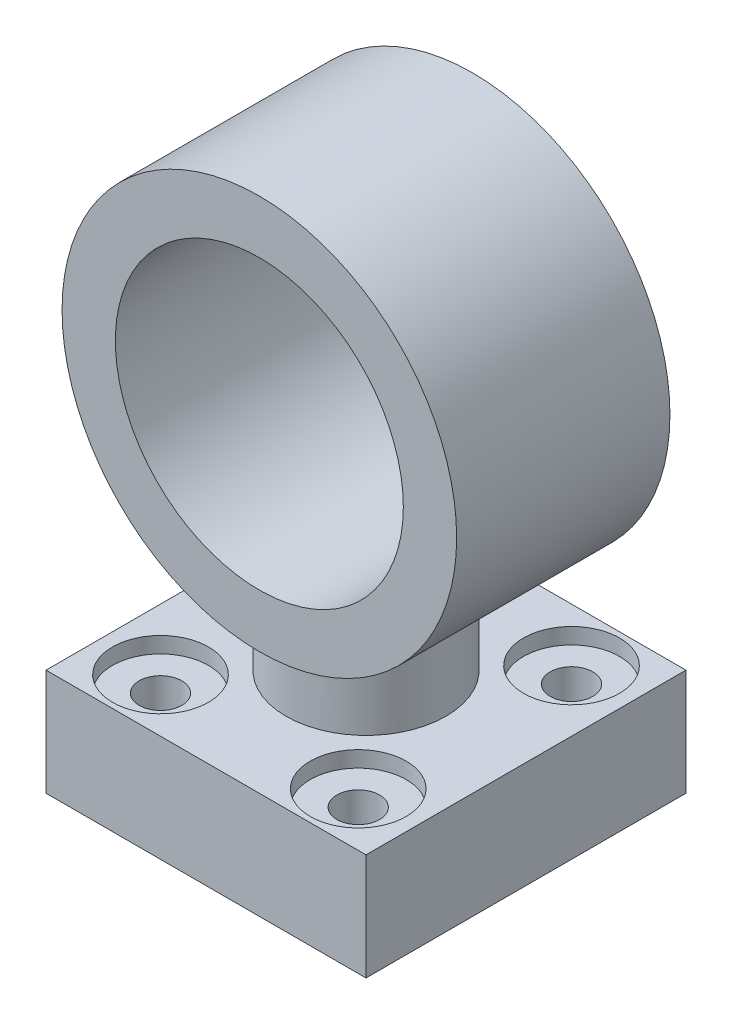
ISO-10303-21;
HEADER;
FILE_DESCRIPTION(('STEP AP214'),'2;1');
FILE_NAME('part.step','',(''),(''),'','','');
FILE_SCHEMA(('AUTOMOTIVE_DESIGN { 1 0 10303 214 1 1 1 1 }'));
ENDSEC;
DATA;
#1=APPLICATION_CONTEXT('core data for automotive mechanical design processes');
#2=APPLICATION_PROTOCOL_DEFINITION('international standard','automotive_design',2000,#1);
#3=PRODUCT_CONTEXT('',#1,'mechanical');
#4=PRODUCT('Part','Part','',(#3));
#5=PRODUCT_RELATED_PRODUCT_CATEGORY('part','',(#4));
#6=PRODUCT_DEFINITION_FORMATION('','',#4);
#7=PRODUCT_DEFINITION_CONTEXT('part definition',#1,'design');
#8=PRODUCT_DEFINITION('design','',#6,#7);
#9=PRODUCT_DEFINITION_SHAPE('','',#8);
#10=(LENGTH_UNIT() NAMED_UNIT(*) SI_UNIT(.MILLI.,.METRE.));
#11=(NAMED_UNIT(*) PLANE_ANGLE_UNIT() SI_UNIT($,.RADIAN.));
#12=(NAMED_UNIT(*) SI_UNIT($,.STERADIAN.) SOLID_ANGLE_UNIT());
#13=UNCERTAINTY_MEASURE_WITH_UNIT(LENGTH_MEASURE(1.E-05),#10,'distance_accuracy_value','');
#14=(GEOMETRIC_REPRESENTATION_CONTEXT(3) GLOBAL_UNCERTAINTY_ASSIGNED_CONTEXT((#13)) GLOBAL_UNIT_ASSIGNED_CONTEXT((#10,
#11,#12)) REPRESENTATION_CONTEXT('',''));
#15=CARTESIAN_POINT('',(0.,0.,0.));
#16=DIRECTION('',(0.,0.,1.));
#17=DIRECTION('',(1.,0.,0.));
#18=AXIS2_PLACEMENT_3D('',#15,#16,#17);
#19=CARTESIAN_POINT('',(-9.27044025157248,-20.,10.));
#20=DIRECTION('',(0.,-1.,0.));
#21=DIRECTION('',(0.,0.,-1.));
#22=AXIS2_PLACEMENT_3D('',#19,#20,#21);
#23=CYLINDRICAL_SURFACE('',#22,2.);
#24=CARTESIAN_POINT('',(-9.27044025157248,-35.,10.));
#25=DIRECTION('',(0.,-1.,0.));
#26=DIRECTION('',(0.,0.,-1.));
#27=AXIS2_PLACEMENT_3D('',#24,#25,#26);
#28=CIRCLE('',#27,2.);
#29=CARTESIAN_POINT('',(-9.27044025157248,-35.,8.));
#30=VERTEX_POINT('',#29);
#31=EDGE_CURVE('E111',#30,#30,#28,.T.);
#32=ORIENTED_EDGE('',*,*,#31,.T.);
#33=EDGE_LOOP('',(#32));
#34=FACE_BOUND('',#33,.T.);
#35=CARTESIAN_POINT('',(-9.27044025157248,-26.5,10.));
#36=DIRECTION('',(0.,1.,0.));
#37=DIRECTION('',(0.,0.,1.));
#38=AXIS2_PLACEMENT_3D('',#35,#36,#37);
#39=CIRCLE('',#38,2.);
#40=CARTESIAN_POINT('',(-9.27044025157248,-26.5,12.));
#41=VERTEX_POINT('',#40);
#42=EDGE_CURVE('E42',#41,#41,#39,.F.);
#43=ORIENTED_EDGE('',*,*,#42,.F.);
#44=EDGE_LOOP('',(#43));
#45=FACE_BOUND('',#44,.T.);
#46=ADVANCED_FACE('F37',(#34,#45),#23,.F.);
#47=CARTESIAN_POINT('',(9.27044025157248,-20.,-10.));
#48=DIRECTION('',(0.,-1.,0.));
#49=DIRECTION('',(0.,0.,-1.));
#50=AXIS2_PLACEMENT_3D('',#47,#48,#49);
#51=CYLINDRICAL_SURFACE('',#50,2.);
#52=CARTESIAN_POINT('',(9.27044025157248,-35.,-10.));
#53=DIRECTION('',(0.,-1.,0.));
#54=DIRECTION('',(0.,0.,-1.));
#55=AXIS2_PLACEMENT_3D('',#52,#53,#54);
#56=CIRCLE('',#55,2.);
#57=CARTESIAN_POINT('',(9.27044025157248,-35.,-12.));
#58=VERTEX_POINT('',#57);
#59=EDGE_CURVE('E202',#58,#58,#56,.T.);
#60=ORIENTED_EDGE('',*,*,#59,.T.);
#61=EDGE_LOOP('',(#60));
#62=FACE_BOUND('',#61,.T.);
#63=CARTESIAN_POINT('',(9.27044025157248,-26.5,-10.));
#64=DIRECTION('',(0.,1.,0.));
#65=DIRECTION('',(0.,0.,1.));
#66=AXIS2_PLACEMENT_3D('',#63,#64,#65);
#67=CIRCLE('',#66,2.);
#68=CARTESIAN_POINT('',(9.27044025157248,-26.5,-8.));
#69=VERTEX_POINT('',#68);
#70=EDGE_CURVE('E421',#69,#69,#67,.F.);
#71=ORIENTED_EDGE('',*,*,#70,.F.);
#72=EDGE_LOOP('',(#71));
#73=FACE_BOUND('',#72,.T.);
#74=ADVANCED_FACE('F161',(#62,#73),#51,.F.);
#75=CARTESIAN_POINT('',(-9.27044025157248,-20.,-10.));
#76=DIRECTION('',(0.,-1.,0.));
#77=DIRECTION('',(0.,0.,-1.));
#78=AXIS2_PLACEMENT_3D('',#75,#76,#77);
#79=CYLINDRICAL_SURFACE('',#78,2.);
#80=CARTESIAN_POINT('',(-9.27044025157248,-35.,-10.));
#81=DIRECTION('',(0.,-1.,0.));
#82=DIRECTION('',(0.,0.,-1.));
#83=AXIS2_PLACEMENT_3D('',#80,#81,#82);
#84=CIRCLE('',#83,2.);
#85=CARTESIAN_POINT('',(-9.27044025157248,-35.,-12.));
#86=VERTEX_POINT('',#85);
#87=EDGE_CURVE('E199',#86,#86,#84,.T.);
#88=ORIENTED_EDGE('',*,*,#87,.T.);
#89=EDGE_LOOP('',(#88));
#90=FACE_BOUND('',#89,.T.);
#91=CARTESIAN_POINT('',(-9.27044025157248,-26.5,-10.));
#92=DIRECTION('',(0.,1.,0.));
#93=DIRECTION('',(0.,0.,1.));
#94=AXIS2_PLACEMENT_3D('',#91,#92,#93);
#95=CIRCLE('',#94,2.);
#96=CARTESIAN_POINT('',(-9.27044025157248,-26.5,-8.));
#97=VERTEX_POINT('',#96);
#98=EDGE_CURVE('E423',#97,#97,#95,.F.);
#99=ORIENTED_EDGE('',*,*,#98,.F.);
#100=EDGE_LOOP('',(#99));
#101=FACE_BOUND('',#100,.T.);
#102=ADVANCED_FACE('F167',(#90,#101),#79,.F.);
#103=CARTESIAN_POINT('',(9.27044025157248,-20.,10.));
#104=DIRECTION('',(0.,-1.,0.));
#105=DIRECTION('',(0.,0.,-1.));
#106=AXIS2_PLACEMENT_3D('',#103,#104,#105);
#107=CYLINDRICAL_SURFACE('',#106,2.);
#108=CARTESIAN_POINT('',(9.27044025157248,-35.,10.));
#109=DIRECTION('',(0.,-1.,0.));
#110=DIRECTION('',(0.,0.,-1.));
#111=AXIS2_PLACEMENT_3D('',#108,#109,#110);
#112=CIRCLE('',#111,2.);
#113=CARTESIAN_POINT('',(9.27044025157248,-35.,8.));
#114=VERTEX_POINT('',#113);
#115=EDGE_CURVE('E198',#114,#114,#112,.T.);
#116=ORIENTED_EDGE('',*,*,#115,.T.);
#117=EDGE_LOOP('',(#116));
#118=FACE_BOUND('',#117,.T.);
#119=CARTESIAN_POINT('',(9.27044025157248,-26.5,10.));
#120=DIRECTION('',(0.,1.,0.));
#121=DIRECTION('',(0.,0.,1.));
#122=AXIS2_PLACEMENT_3D('',#119,#120,#121);
#123=CIRCLE('',#122,2.);
#124=CARTESIAN_POINT('',(9.27044025157248,-26.5,12.));
#125=VERTEX_POINT('',#124);
#126=EDGE_CURVE('E136',#125,#125,#123,.F.);
#127=ORIENTED_EDGE('',*,*,#126,.F.);
#128=EDGE_LOOP('',(#127));
#129=FACE_BOUND('',#128,.T.);
#130=ADVANCED_FACE('F249',(#118,#129),#107,.F.);
#131=CARTESIAN_POINT('',(0.,0.,10.));
#132=DIRECTION('',(0.,0.,-1.));
#133=DIRECTION('',(-1.,0.,0.));
#134=AXIS2_PLACEMENT_3D('',#131,#132,#133);
#135=CYLINDRICAL_SURFACE('',#134,18.5);
#136=CARTESIAN_POINT('',(0.,0.,10.));
#137=DIRECTION('',(0.,0.,1.));
#138=DIRECTION('',(1.,0.,0.));
#139=AXIS2_PLACEMENT_3D('',#136,#137,#138);
#140=CIRCLE('',#139,18.5);
#141=CARTESIAN_POINT('',(18.5,0.,10.));
#142=VERTEX_POINT('',#141);
#143=EDGE_CURVE('E48',#142,#142,#140,.T.);
#144=ORIENTED_EDGE('',*,*,#143,.F.);
#145=EDGE_LOOP('',(#144));
#146=FACE_BOUND('',#145,.T.);
#147=CARTESIAN_POINT('',(0.,0.,-10.));
#148=DIRECTION('',(0.,0.,1.));
#149=DIRECTION('',(1.,0.,0.));
#150=AXIS2_PLACEMENT_3D('',#147,#148,#149);
#151=CIRCLE('',#150,18.5);
#152=CARTESIAN_POINT('',(18.5,0.,-10.));
#153=VERTEX_POINT('',#152);
#154=EDGE_CURVE('E125',#153,#153,#151,.T.);
#155=ORIENTED_EDGE('',*,*,#154,.T.);
#156=EDGE_LOOP('',(#155));
#157=FACE_BOUND('',#156,.T.);
#158=CARTESIAN_POINT('',(0.,-18.5,-7.5));
#159=CARTESIAN_POINT('',(0.201422121752184,-18.4999990328544,-7.49999877105642));
#160=CARTESIAN_POINT('',(0.402918862864895,-18.4967013616093,-7.49187469466253));
#161=CARTESIAN_POINT('',(0.804483964389173,-18.4835930999458,-7.45945228511354));
#162=CARTESIAN_POINT('',(1.00455129959909,-18.4737782328099,-7.43514333108197));
#163=CARTESIAN_POINT('',(1.40211676524176,-18.4478678444109,-7.37052953386558));
#164=CARTESIAN_POINT('',(1.59960854623983,-18.4317590458145,-7.33019087219798));
#165=CARTESIAN_POINT('',(1.99024923810295,-18.3936794594012,-7.23390611661211));
#166=CARTESIAN_POINT('',(2.18339633804079,-18.3717062745744,-7.17795364027382));
#167=CARTESIAN_POINT('',(2.56325558935261,-18.3225616152204,-7.05121696220772));
#168=CARTESIAN_POINT('',(2.74998916086765,-18.2954099488868,-6.98048918223338));
#169=CARTESIAN_POINT('',(3.11668633030813,-18.236522913892,-6.82465908531963));
#170=CARTESIAN_POINT('',(3.29664733333966,-18.2047858104214,-6.73955132592533));
#171=CARTESIAN_POINT('',(3.64855035166081,-18.1375342743215,-6.55571960537027));
#172=CARTESIAN_POINT('',(3.82049836736329,-18.1020227356975,-6.45700605929998));
#173=CARTESIAN_POINT('',(4.15565333403188,-18.0280340597832,-6.24657627183053));
#174=CARTESIAN_POINT('',(4.318857087604,-17.9895558500864,-6.134855320937));
#175=CARTESIAN_POINT('',(4.64255094197372,-17.9088176099161,-5.89399502013234));
#176=CARTESIAN_POINT('',(4.80261058969948,-17.8664657904514,-5.76430774938712));
#177=CARTESIAN_POINT('',(5.11135960892274,-17.7805985333178,-5.49238780930597));
#178=CARTESIAN_POINT('',(5.26004858039983,-17.7370830547839,-5.35015469898608));
#179=CARTESIAN_POINT('',(5.54533199568612,-17.6499732034,-5.05387099423345));
#180=CARTESIAN_POINT('',(5.68191853453983,-17.6063787976891,-4.8998127968092));
#181=CARTESIAN_POINT('',(5.94205832964912,-17.520294285042,-4.58086027342387));
#182=CARTESIAN_POINT('',(6.06561590861363,-17.4778038153937,-4.41596957109371));
#183=CARTESIAN_POINT('',(6.30441245472695,-17.3931358314704,-4.06827994071179));
#184=CARTESIAN_POINT('',(6.41899715321113,-17.3510648072536,-3.8850047773419));
#185=CARTESIAN_POINT('',(6.63218317737933,-17.2707013519035,-3.50868793927397));
#186=CARTESIAN_POINT('',(6.73079101370815,-17.2324073841039,-3.31565028512759));
#187=CARTESIAN_POINT('',(6.91120661388917,-17.1608463268112,-2.92100753245125));
#188=CARTESIAN_POINT('',(6.9930170739032,-17.1275784308057,-2.71940381514749));
#189=CARTESIAN_POINT('',(7.13903680282151,-17.0672318951359,-2.30902071214637));
#190=CARTESIAN_POINT('',(7.20324730363535,-17.0401528223069,-2.10024182982664));
#191=CARTESIAN_POINT('',(7.31080282984704,-16.9942761606526,-1.68690099382171));
#192=CARTESIAN_POINT('',(7.35497541266203,-16.9751535236755,-1.48259047637071));
#193=CARTESIAN_POINT('',(7.42615973107061,-16.9441336720491,-1.07045552069225));
#194=CARTESIAN_POINT('',(7.45317197223554,-16.932236244534,-0.862631186172712));
#195=CARTESIAN_POINT('',(7.48970127630269,-16.9161099348048,-0.44524460530172));
#196=CARTESIAN_POINT('',(7.4992260127419,-16.9118776891112,-0.235683161765361));
#197=CARTESIAN_POINT('',(7.50068324500763,-16.9112316042474,0.183507882082435));
#198=CARTESIAN_POINT('',(7.49261659430145,-16.9148173857762,0.393137478593989));
#199=CARTESIAN_POINT('',(7.46021087725753,-16.9291326530356,0.795633896421227));
#200=CARTESIAN_POINT('',(7.43708752496219,-16.9393282004559,0.988619156674094));
#201=CARTESIAN_POINT('',(7.37602002680758,-16.966008321552,1.37185635962649));
#202=CARTESIAN_POINT('',(7.33807076676344,-16.9824950653251,1.56210733563273));
#203=CARTESIAN_POINT('',(7.24773757689199,-17.0212428904478,1.93849189344553));
#204=CARTESIAN_POINT('',(7.19535718537566,-17.0435025562795,2.12462647246549));
#205=CARTESIAN_POINT('',(7.07661128195854,-17.0931480713131,2.49174830381872));
#206=CARTESIAN_POINT('',(7.01024038896313,-17.1205358924769,2.67273354510096));
#207=CARTESIAN_POINT('',(6.8625845367445,-17.1802619259301,3.03206652762431));
#208=CARTESIAN_POINT('',(6.78102419206458,-17.2126893388475,3.21028616118283));
#209=CARTESIAN_POINT('',(6.60451404688437,-17.2811849876929,3.55930511601025));
#210=CARTESIAN_POINT('',(6.50955971629863,-17.3172544542507,3.73010190106728));
#211=CARTESIAN_POINT('',(6.30690707675619,-17.3920840433727,4.06336837496765));
#212=CARTESIAN_POINT('',(6.19920700512003,-17.430844537787,4.22583690758755));
#213=CARTESIAN_POINT('',(5.97171744568,-17.5100855874212,4.54163695968856));
#214=CARTESIAN_POINT('',(5.85192731658344,-17.550566233817,4.6949679938027));
#215=CARTESIAN_POINT('',(5.5908819484677,-17.6355421933932,5.00360697368469));
#216=CARTESIAN_POINT('',(5.44867652396041,-17.6800999921127,5.1580953166478));
#217=CARTESIAN_POINT('',(5.15181452271063,-17.7688716371796,5.45461355394256));
#218=CARTESIAN_POINT('',(4.9971616060238,-17.8130855804712,5.59664708500135));
#219=CARTESIAN_POINT('',(4.6761463093742,-17.9000368535101,5.86751943447496));
#220=CARTESIAN_POINT('',(4.50977711788315,-17.9427733023958,5.9963504686649));
#221=CARTESIAN_POINT('',(4.16642596233296,-18.0255947467599,6.23980497815171));
#222=CARTESIAN_POINT('',(3.98944827989036,-18.0656807983902,6.35443412883797));
#223=CARTESIAN_POINT('',(3.62198049634587,-18.1429668883961,6.57097387363341));
#224=CARTESIAN_POINT('',(3.43128274002971,-18.1800871651368,6.67256116207671));
#225=CARTESIAN_POINT('',(3.04117392752266,-18.2493968375346,6.85915361093518));
#226=CARTESIAN_POINT('',(2.84176665699116,-18.2815883486381,6.9441658897204));
#227=CARTESIAN_POINT('',(2.43561381907153,-18.3401163548394,7.09681895194935));
#228=CARTESIAN_POINT('',(2.22886969639431,-18.3664539952946,7.16446313400473));
#229=CARTESIAN_POINT('',(1.80959861933909,-18.4124907104072,7.28167038552696));
#230=CARTESIAN_POINT('',(1.59707207888027,-18.4321902588909,7.33123474555033));
#231=CARTESIAN_POINT('',(1.18097318854788,-18.463373605401,7.40927536777576));
#232=CARTESIAN_POINT('',(0.977637510231015,-18.475282524884,7.43884649173111));
#233=CARTESIAN_POINT('',(0.568946328512102,-18.4923800794846,7.48120975582348));
#234=CARTESIAN_POINT('',(0.363590906867655,-18.4975689855041,7.49400257233965));
#235=CARTESIAN_POINT('',(-0.0474864145881197,-18.5010806919054,7.50266632283379));
#236=CARTESIAN_POINT('',(-0.253208217993976,-18.4994050898404,7.49854119406631));
#237=CARTESIAN_POINT('',(-0.663446820263312,-18.4892383502882,7.47342405906379));
#238=CARTESIAN_POINT('',(-0.86796364329637,-18.4807473499769,7.45243239230711));
#239=CARTESIAN_POINT('',(-1.26471586772626,-18.4577389104402,7.39518591232671));
#240=CARTESIAN_POINT('',(-1.4570788216687,-18.4435213849994,7.35968957043622));
#241=CARTESIAN_POINT('',(-1.8380388693583,-18.409459490462,7.27390873642982));
#242=CARTESIAN_POINT('',(-2.02663462253012,-18.3896131552097,7.22361907674673));
#243=CARTESIAN_POINT('',(-2.3987214942848,-18.3447879322591,7.10872976228476));
#244=CARTESIAN_POINT('',(-2.58221407748269,-18.3198105348059,7.04413426201242));
#245=CARTESIAN_POINT('',(-2.94311568181697,-18.2653057156592,6.90114203710166));
#246=CARTESIAN_POINT('',(-3.12052235696178,-18.2357765629266,6.82274006021812));
#247=CARTESIAN_POINT('',(-3.47347176211831,-18.1719049128132,6.65016891133092));
#248=CARTESIAN_POINT('',(-3.64879399739684,-18.1374434083742,6.55559297811237));
#249=CARTESIAN_POINT('',(-3.99092926647629,-18.0652447302139,6.35311061514131));
#250=CARTESIAN_POINT('',(-4.15773935828628,-18.0275064359718,6.24519961999192));
#251=CARTESIAN_POINT('',(-4.48194294207282,-17.9496514528005,6.01676962443998));
#252=CARTESIAN_POINT('',(-4.63933480315663,-17.9095343543303,5.89624845029019));
#253=CARTESIAN_POINT('',(-4.9438797275276,-17.8278690104994,5.64333556557746));
#254=CARTESIAN_POINT('',(-5.09103232803625,-17.7863207005797,5.51094331910197));
#255=CARTESIAN_POINT('',(-5.3839985522337,-17.699927748392,5.22562543550254));
#256=CARTESIAN_POINT('',(-5.529040147805,-17.6550511349149,5.07191564524168));
#257=CARTESIAN_POINT('',(-5.80568914984553,-17.5660208497473,4.75274270769811));
#258=CARTESIAN_POINT('',(-5.9373006983414,-17.5218669587073,4.58728321106186));
#259=CARTESIAN_POINT('',(-6.18638017795834,-17.4354836570948,4.24540392390819));
#260=CARTESIAN_POINT('',(-6.30383973024932,-17.3932553957159,4.06897773323612));
#261=CARTESIAN_POINT('',(-6.52364564578381,-17.3120124886841,3.70634341363837));
#262=CARTESIAN_POINT('',(-6.62599835498555,-17.2729964967106,3.52013943690649));
#263=CARTESIAN_POINT('',(-6.81592872062919,-17.1989427880968,3.13678196202815));
#264=CARTESIAN_POINT('',(-6.90332062361936,-17.1639566375332,2.93952627712936));
#265=CARTESIAN_POINT('',(-7.06100220741314,-17.0996930203209,2.53748822757217));
#266=CARTESIAN_POINT('',(-7.1312996770789,-17.0704129549789,2.33270933990865));
#267=CARTESIAN_POINT('',(-7.25407181788305,-17.0186041465238,1.91712441708121));
#268=CARTESIAN_POINT('',(-7.30655370357511,-16.9960726709549,1.70632085923764));
#269=CARTESIAN_POINT('',(-7.39310791127433,-16.9586022415907,1.28030740870965));
#270=CARTESIAN_POINT('',(-7.42718183452202,-16.9436626274142,1.06509790097331));
#271=CARTESIAN_POINT('',(-7.4746729218975,-16.9227621896836,0.648080763265321));
#272=CARTESIAN_POINT('',(-7.48942661464656,-16.9162211214409,0.446453434694328));
#273=CARTESIAN_POINT('',(-7.50259995518058,-16.9103828957062,0.0425653074794392));
#274=CARTESIAN_POINT('',(-7.50102043961319,-16.9110853671732,-0.159695458186888));
#275=CARTESIAN_POINT('',(-7.48154794075019,-16.9197089588305,-0.563246259827526));
#276=CARTESIAN_POINT('',(-7.46365697984273,-16.9276291841214,-0.764536413033796));
#277=CARTESIAN_POINT('',(-7.41176990870633,-16.9504120061495,-1.16462788361027));
#278=CARTESIAN_POINT('',(-7.37777388919296,-16.9652745637823,-1.36342921499288));
#279=CARTESIAN_POINT('',(-7.29580978455673,-17.0006781921456,-1.74880683293399));
#280=CARTESIAN_POINT('',(-7.24848882599139,-17.0209544115938,-1.9355457977917));
#281=CARTESIAN_POINT('',(-7.139831303421,-17.0668182328447,-2.30429427719021));
#282=CARTESIAN_POINT('',(-7.07848988004423,-17.0924076758824,-2.48630212755176));
#283=CARTESIAN_POINT('',(-6.94231962830986,-17.1481662208332,-2.84444835761395));
#284=CARTESIAN_POINT('',(-6.867492729195,-17.1783346675731,-3.02058757262095));
#285=CARTESIAN_POINT('',(-6.70491039467438,-17.2424421023238,-3.36610746266711));
#286=CARTESIAN_POINT('',(-6.61715025917631,-17.2763824599847,-3.53548565210987));
#287=CARTESIAN_POINT('',(-6.32446483937138,-17.3866693825447,-4.05131026704725));
#288=CARTESIAN_POINT('',(-6.09796317493246,-17.4681215188133,-4.38472201917218));
#289=CARTESIAN_POINT('',(-5.59524024724509,-17.6355676545245,-5.0104359777776));
#290=CARTESIAN_POINT('',(-5.3190032607044,-17.7215630841888,-5.30272513157989));
#291=CARTESIAN_POINT('',(-4.86200220938913,-17.8504445987302,-5.71462059383084));
#292=CARTESIAN_POINT('',(-4.69669358160358,-17.8947545199068,-5.85124981621434));
#293=CARTESIAN_POINT('',(-4.35461381493769,-17.9810567524008,-6.11009770157836));
#294=CARTESIAN_POINT('',(-4.17784650764549,-18.0230498298256,-6.23232114347323));
#295=CARTESIAN_POINT('',(-3.81377140272023,-18.1035891399998,-6.46153734066139));
#296=CARTESIAN_POINT('',(-3.62645598900894,-18.142132828811,-6.56851888886246));
#297=CARTESIAN_POINT('',(-3.24260339514261,-18.2146550268249,-6.76624856988821));
#298=CARTESIAN_POINT('',(-3.0460669841247,-18.2486339158742,-6.85699805362563));
#299=CARTESIAN_POINT('',(-2.64870822069133,-18.3104900966937,-7.01994506616345));
#300=CARTESIAN_POINT('',(-2.44802548623661,-18.3384656885399,-7.09244549974249));
#301=CARTESIAN_POINT('',(-2.04051897202687,-18.3882680166328,-7.22024008503056));
#302=CARTESIAN_POINT('',(-1.83369580128345,-18.4100953604289,-7.27553593689533));
#303=CARTESIAN_POINT('',(-1.41607215223257,-18.4469122300236,-7.36820021656318));
#304=CARTESIAN_POINT('',(-1.20528394049213,-18.4619200853141,-7.40561671483558));
#305=CARTESIAN_POINT('',(-0.781001274209438,-18.4847261917663,-7.46229070726684));
#306=CARTESIAN_POINT('',(-0.567508970443885,-18.492529847696,-7.48156181476195));
#307=CARTESIAN_POINT('',(-0.294716629357235,-18.497746446973,-7.4944395439902));
#308=CARTESIAN_POINT('',(-0.235797648832599,-18.4985911360796,-7.49652422168391));
#309=CARTESIAN_POINT('',(-0.117921243725272,-18.4997180542747,-7.49930462986837));
#310=CARTESIAN_POINT('',(-0.0589638191259534,-18.5000002831198,-7.50000035975794));
#311=CARTESIAN_POINT('',(0.,-18.5,-7.5));
#312=B_SPLINE_CURVE_WITH_KNOTS('',3,(#158,#159,#160,#161,#162,#163,#164,#165,#166,#167,#168,
#169,#170,#171,#172,#173,#174,#175,#176,#177,#178,#179,#180,#181,#182,#183,#184,#185,#186,#187,
#188,#189,#190,#191,#192,#193,#194,#195,#196,#197,#198,#199,#200,#201,#202,#203,#204,#205,#206,
#207,#208,#209,#210,#211,#212,#213,#214,#215,#216,#217,#218,#219,#220,#221,#222,#223,#224,#225,
#226,#227,#228,#229,#230,#231,#232,#233,#234,#235,#236,#237,#238,#239,#240,#241,#242,#243,#244,
#245,#246,#247,#248,#249,#250,#251,#252,#253,#254,#255,#256,#257,#258,#259,#260,#261,#262,#263,
#264,#265,#266,#267,#268,#269,#270,#271,#272,#273,#274,#275,#276,#277,#278,#279,#280,#281,#282,
#283,#284,#285,#286,#287,#288,#289,#290,#291,#292,#293,#294,#295,#296,#297,#298,#299,#300,#301,
#302,#303,#304,#305,#306,#307,#308,#309,#310,#311),.UNSPECIFIED.,.T.,.F.,(4,2,2,2,2,2,2,2,2,2,2,
2,2,2,2,2,2,2,2,2,2,2,2,2,2,2,2,2,2,2,2,2,2,2,2,2,2,2,2,2,2,2,2,2,2,2,2,2,2,2,2,2,2,2,2,2,2,2,2,
2,2,2,2,2,2,2,2,2,2,2,2,2,2,2,2,2,4),(0.,0.604205964614024,1.20880881391747,1.81469404713552,
2.42082731025277,3.02468693967534,3.62877562859464,4.23240443580314,4.83625247806008,
5.46649571663921,6.0967611169864,6.72743519945117,7.35789937602635,8.01768939235975,
8.67720986130122,9.33662438712486,9.99599274541968,10.6248706421962,11.2537300103565,
11.8823133682995,12.5108662304433,13.0940809963584,13.6774971196193,14.2607703245397,
14.8442682815212,15.4396103251217,16.0351542090034,16.6307805504209,17.2264385022564,
17.8696549007905,18.5126828543752,19.1560877835412,19.799234758676,20.4560951699422,
21.1126728589064,21.7691219698114,22.4255242135219,23.0421945554046,23.6588400368666,
24.2753420167159,24.8918315883384,25.4795346090989,26.0674431691872,26.6551812202704,
27.243143342954,27.8489738731944,28.4550123934431,29.0611555554859,29.6673260952942,
30.3147316750869,30.9619369780054,31.6095236016556,32.2568374134506,32.9116823402482,
33.566228333818,34.2205089470138,34.8747326375928,35.4807733281655,36.0867829752353,
36.6927174959103,37.2986486035556,37.8791186928964,38.4597902740421,39.0403788497026,
39.6211789408681,40.8492541870292,42.0777183599922,42.7340270355291,43.3901173734573,
44.0466876603785,44.7032032788206,45.3479714792135,45.9926759433991,46.6356371626746,
47.2781156236628,47.454989322948,47.6318630987895),.UNSPECIFIED.);
#313=CARTESIAN_POINT('',(0.,-18.5,-7.5));
#314=VERTEX_POINT('',#313);
#315=EDGE_CURVE('E11',#314,#314,#312,.T.);
#316=ORIENTED_EDGE('',*,*,#315,.F.);
#317=EDGE_LOOP('',(#316));
#318=FACE_BOUND('',#317,.T.);
#319=ADVANCED_FACE('F39',(#146,#157,#318),#135,.T.);
#320=CARTESIAN_POINT('',(0.,0.,10.));
#321=DIRECTION('',(0.,0.,1.));
#322=DIRECTION('',(1.,0.,0.));
#323=AXIS2_PLACEMENT_3D('',#320,#321,#322);
#324=PLANE('',#323);
#325=ORIENTED_EDGE('',*,*,#143,.T.);
#326=EDGE_LOOP('',(#325));
#327=FACE_BOUND('',#326,.T.);
#328=CARTESIAN_POINT('',(0.,0.,10.));
#329=DIRECTION('',(0.,0.,1.));
#330=DIRECTION('',(1.,0.,0.));
#331=AXIS2_PLACEMENT_3D('',#328,#329,#330);
#332=CIRCLE('',#331,13.5);
#333=CARTESIAN_POINT('',(13.5,0.,10.));
#334=VERTEX_POINT('',#333);
#335=EDGE_CURVE('E122',#334,#334,#332,.T.);
#336=ORIENTED_EDGE('',*,*,#335,.F.);
#337=EDGE_LOOP('',(#336));
#338=FACE_BOUND('',#337,.T.);
#339=ADVANCED_FACE('F151',(#327,#338),#324,.T.);
#340=CARTESIAN_POINT('',(0.,0.,-10.));
#341=DIRECTION('',(0.,0.,1.));
#342=DIRECTION('',(1.,0.,0.));
#343=AXIS2_PLACEMENT_3D('',#340,#341,#342);
#344=PLANE('',#343);
#345=ORIENTED_EDGE('',*,*,#154,.F.);
#346=EDGE_LOOP('',(#345));
#347=FACE_BOUND('',#346,.T.);
#348=CARTESIAN_POINT('',(0.,0.,-10.));
#349=DIRECTION('',(0.,0.,1.));
#350=DIRECTION('',(1.,0.,0.));
#351=AXIS2_PLACEMENT_3D('',#348,#349,#350);
#352=CIRCLE('',#351,13.5);
#353=CARTESIAN_POINT('',(13.5,0.,-10.));
#354=VERTEX_POINT('',#353);
#355=EDGE_CURVE('E121',#354,#354,#352,.T.);
#356=ORIENTED_EDGE('',*,*,#355,.T.);
#357=EDGE_LOOP('',(#356));
#358=FACE_BOUND('',#357,.T.);
#359=ADVANCED_FACE('F149',(#347,#358),#344,.F.);
#360=CARTESIAN_POINT('',(0.,0.,10.));
#361=DIRECTION('',(0.,0.,-1.));
#362=DIRECTION('',(-1.,0.,0.));
#363=AXIS2_PLACEMENT_3D('',#360,#361,#362);
#364=CYLINDRICAL_SURFACE('',#363,13.5);
#365=ORIENTED_EDGE('',*,*,#335,.T.);
#366=EDGE_LOOP('',(#365));
#367=FACE_BOUND('',#366,.T.);
#368=ORIENTED_EDGE('',*,*,#355,.F.);
#369=EDGE_LOOP('',(#368));
#370=FACE_BOUND('',#369,.T.);
#371=ADVANCED_FACE('F144',(#367,#370),#364,.F.);
#372=CARTESIAN_POINT('',(0.,18.501,0.));
#373=DIRECTION('',(0.,-1.,0.));
#374=DIRECTION('',(0.,0.,-1.));
#375=AXIS2_PLACEMENT_3D('',#372,#373,#374);
#376=CYLINDRICAL_SURFACE('',#375,7.5);
#377=CARTESIAN_POINT('',(0.,-25.,0.));
#378=DIRECTION('',(0.,1.,0.));
#379=DIRECTION('',(0.,0.,1.));
#380=AXIS2_PLACEMENT_3D('',#377,#378,#379);
#381=CIRCLE('',#380,7.5);
#382=CARTESIAN_POINT('',(0.,-25.,7.5));
#383=VERTEX_POINT('',#382);
#384=EDGE_CURVE('E118',#383,#383,#381,.T.);
#385=ORIENTED_EDGE('',*,*,#384,.T.);
#386=EDGE_LOOP('',(#385));
#387=FACE_BOUND('',#386,.T.);
#388=ORIENTED_EDGE('',*,*,#315,.T.);
#389=EDGE_LOOP('',(#388));
#390=FACE_BOUND('',#389,.T.);
#391=ADVANCED_FACE('F138',(#387,#390),#376,.T.);
#392=CARTESIAN_POINT('',(15.,-35.,15.));
#393=DIRECTION('',(-1.,0.,0.));
#394=DIRECTION('',(0.,0.,1.));
#395=AXIS2_PLACEMENT_3D('',#392,#393,#394);
#396=PLANE('',#395);
#397=DIRECTION('',(0.,0.,1.));
#398=VECTOR('',#397,1.);
#399=CARTESIAN_POINT('',(15.,-25.,15.));
#400=LINE('',#399,#398);
#401=CARTESIAN_POINT('',(15.,-25.,-15.));
#402=VERTEX_POINT('',#401);
#403=CARTESIAN_POINT('',(15.,-25.,15.));
#404=VERTEX_POINT('',#403);
#405=EDGE_CURVE('E108',#402,#404,#400,.T.);
#406=ORIENTED_EDGE('',*,*,#405,.T.);
#407=DIRECTION('',(0.,1.,0.));
#408=VECTOR('',#407,1.);
#409=CARTESIAN_POINT('',(15.,-35.,15.));
#410=LINE('',#409,#408);
#411=CARTESIAN_POINT('',(15.,-35.,15.));
#412=VERTEX_POINT('',#411);
#413=EDGE_CURVE('E99',#412,#404,#410,.T.);
#414=ORIENTED_EDGE('',*,*,#413,.F.);
#415=DIRECTION('',(0.,0.,1.));
#416=VECTOR('',#415,1.);
#417=CARTESIAN_POINT('',(15.,-35.,15.));
#418=LINE('',#417,#416);
#419=CARTESIAN_POINT('',(15.,-35.,-15.));
#420=VERTEX_POINT('',#419);
#421=EDGE_CURVE('E93',#420,#412,#418,.T.);
#422=ORIENTED_EDGE('',*,*,#421,.F.);
#423=DIRECTION('',(0.,1.,0.));
#424=VECTOR('',#423,1.);
#425=CARTESIAN_POINT('',(15.,-35.,-15.));
#426=LINE('',#425,#424);
#427=EDGE_CURVE('E104',#420,#402,#426,.T.);
#428=ORIENTED_EDGE('',*,*,#427,.T.);
#429=EDGE_LOOP('',(#406,#414,#422,#428));
#430=FACE_BOUND('',#429,.T.);
#431=ADVANCED_FACE('F143',(#430),#396,.F.);
#432=CARTESIAN_POINT('',(-15.,-35.,15.));
#433=DIRECTION('',(0.,0.,-1.));
#434=DIRECTION('',(-1.,0.,0.));
#435=AXIS2_PLACEMENT_3D('',#432,#433,#434);
#436=PLANE('',#435);
#437=DIRECTION('',(-1.,0.,0.));
#438=VECTOR('',#437,1.);
#439=CARTESIAN_POINT('',(-15.,-25.,15.));
#440=LINE('',#439,#438);
#441=CARTESIAN_POINT('',(-15.,-25.,15.));
#442=VERTEX_POINT('',#441);
#443=EDGE_CURVE('E98',#404,#442,#440,.T.);
#444=ORIENTED_EDGE('',*,*,#443,.T.);
#445=DIRECTION('',(0.,1.,0.));
#446=VECTOR('',#445,1.);
#447=CARTESIAN_POINT('',(-15.,-35.,15.));
#448=LINE('',#447,#446);
#449=CARTESIAN_POINT('',(-15.,-35.,15.));
#450=VERTEX_POINT('',#449);
#451=EDGE_CURVE('E96',#450,#442,#448,.T.);
#452=ORIENTED_EDGE('',*,*,#451,.F.);
#453=DIRECTION('',(-1.,0.,0.));
#454=VECTOR('',#453,1.);
#455=CARTESIAN_POINT('',(-15.,-35.,15.));
#456=LINE('',#455,#454);
#457=EDGE_CURVE('E88',#412,#450,#456,.T.);
#458=ORIENTED_EDGE('',*,*,#457,.F.);
#459=ORIENTED_EDGE('',*,*,#413,.T.);
#460=EDGE_LOOP('',(#444,#452,#458,#459));
#461=FACE_BOUND('',#460,.T.);
#462=ADVANCED_FACE('F97',(#461),#436,.F.);
#463=CARTESIAN_POINT('',(-15.,-35.,15.));
#464=DIRECTION('',(1.,0.,0.));
#465=DIRECTION('',(0.,0.,-1.));
#466=AXIS2_PLACEMENT_3D('',#463,#464,#465);
#467=PLANE('',#466);
#468=DIRECTION('',(0.,0.,-1.));
#469=VECTOR('',#468,1.);
#470=CARTESIAN_POINT('',(-15.,-25.,15.));
#471=LINE('',#470,#469);
#472=CARTESIAN_POINT('',(-15.,-25.,-15.));
#473=VERTEX_POINT('',#472);
#474=EDGE_CURVE('E74',#442,#473,#471,.T.);
#475=ORIENTED_EDGE('',*,*,#474,.T.);
#476=DIRECTION('',(0.,1.,0.));
#477=VECTOR('',#476,1.);
#478=CARTESIAN_POINT('',(-15.,-35.,-15.));
#479=LINE('',#478,#477);
#480=CARTESIAN_POINT('',(-15.,-35.,-15.));
#481=VERTEX_POINT('',#480);
#482=EDGE_CURVE('E100',#481,#473,#479,.T.);
#483=ORIENTED_EDGE('',*,*,#482,.F.);
#484=DIRECTION('',(0.,0.,-1.));
#485=VECTOR('',#484,1.);
#486=CARTESIAN_POINT('',(-15.,-35.,15.));
#487=LINE('',#486,#485);
#488=EDGE_CURVE('E91',#450,#481,#487,.T.);
#489=ORIENTED_EDGE('',*,*,#488,.F.);
#490=ORIENTED_EDGE('',*,*,#451,.T.);
#491=EDGE_LOOP('',(#475,#483,#489,#490));
#492=FACE_BOUND('',#491,.T.);
#493=ADVANCED_FACE('F102',(#492),#467,.F.);
#494=CARTESIAN_POINT('',(-15.,-35.,-15.));
#495=DIRECTION('',(0.,0.,1.));
#496=DIRECTION('',(1.,0.,0.));
#497=AXIS2_PLACEMENT_3D('',#494,#495,#496);
#498=PLANE('',#497);
#499=DIRECTION('',(1.,0.,0.));
#500=VECTOR('',#499,1.);
#501=CARTESIAN_POINT('',(-15.,-25.,-15.));
#502=LINE('',#501,#500);
#503=EDGE_CURVE('E80',#473,#402,#502,.T.);
#504=ORIENTED_EDGE('',*,*,#503,.T.);
#505=ORIENTED_EDGE('',*,*,#427,.F.);
#506=DIRECTION('',(1.,0.,0.));
#507=VECTOR('',#506,1.);
#508=CARTESIAN_POINT('',(-15.,-35.,-15.));
#509=LINE('',#508,#507);
#510=EDGE_CURVE('E57',#481,#420,#509,.T.);
#511=ORIENTED_EDGE('',*,*,#510,.F.);
#512=ORIENTED_EDGE('',*,*,#482,.T.);
#513=EDGE_LOOP('',(#504,#505,#511,#512));
#514=FACE_BOUND('',#513,.T.);
#515=ADVANCED_FACE('F178',(#514),#498,.F.);
#516=CARTESIAN_POINT('',(0.,-35.,0.));
#517=DIRECTION('',(0.,-1.,0.));
#518=DIRECTION('',(0.,0.,-1.));
#519=AXIS2_PLACEMENT_3D('',#516,#517,#518);
#520=PLANE('',#519);
#521=ORIENTED_EDGE('',*,*,#115,.F.);
#522=EDGE_LOOP('',(#521));
#523=FACE_BOUND('',#522,.T.);
#524=ORIENTED_EDGE('',*,*,#87,.F.);
#525=EDGE_LOOP('',(#524));
#526=FACE_BOUND('',#525,.T.);
#527=ORIENTED_EDGE('',*,*,#59,.F.);
#528=EDGE_LOOP('',(#527));
#529=FACE_BOUND('',#528,.T.);
#530=ORIENTED_EDGE('',*,*,#31,.F.);
#531=EDGE_LOOP('',(#530));
#532=FACE_BOUND('',#531,.T.);
#533=ORIENTED_EDGE('',*,*,#421,.T.);
#534=ORIENTED_EDGE('',*,*,#457,.T.);
#535=ORIENTED_EDGE('',*,*,#488,.T.);
#536=ORIENTED_EDGE('',*,*,#510,.T.);
#537=EDGE_LOOP('',(#533,#534,#535,#536));
#538=FACE_BOUND('',#537,.T.);
#539=ADVANCED_FACE('F89',(#523,#526,#529,#532,#538),#520,.T.);
#540=CARTESIAN_POINT('',(0.,-25.,0.));
#541=DIRECTION('',(0.,-1.,0.));
#542=DIRECTION('',(0.,0.,-1.));
#543=AXIS2_PLACEMENT_3D('',#540,#541,#542);
#544=PLANE('',#543);
#545=CARTESIAN_POINT('',(-9.27044025157248,-25.,-10.));
#546=DIRECTION('',(0.,1.,0.));
#547=DIRECTION('',(0.,0.,1.));
#548=AXIS2_PLACEMENT_3D('',#545,#546,#547);
#549=CIRCLE('',#548,4.5);
#550=CARTESIAN_POINT('',(-9.27044025157248,-25.,-5.5));
#551=VERTEX_POINT('',#550);
#552=EDGE_CURVE('E214',#551,#551,#549,.T.);
#553=ORIENTED_EDGE('',*,*,#552,.F.);
#554=EDGE_LOOP('',(#553));
#555=FACE_BOUND('',#554,.T.);
#556=CARTESIAN_POINT('',(9.27044025157248,-25.,-10.));
#557=DIRECTION('',(0.,1.,0.));
#558=DIRECTION('',(0.,0.,1.));
#559=AXIS2_PLACEMENT_3D('',#556,#557,#558);
#560=CIRCLE('',#559,4.5);
#561=CARTESIAN_POINT('',(9.27044025157248,-25.,-5.5));
#562=VERTEX_POINT('',#561);
#563=EDGE_CURVE('E220',#562,#562,#560,.T.);
#564=ORIENTED_EDGE('',*,*,#563,.F.);
#565=EDGE_LOOP('',(#564));
#566=FACE_BOUND('',#565,.T.);
#567=CARTESIAN_POINT('',(9.27044025157248,-25.,10.));
#568=DIRECTION('',(0.,1.,0.));
#569=DIRECTION('',(0.,0.,1.));
#570=AXIS2_PLACEMENT_3D('',#567,#568,#569);
#571=CIRCLE('',#570,4.5);
#572=CARTESIAN_POINT('',(9.27044025157248,-25.,14.5));
#573=VERTEX_POINT('',#572);
#574=EDGE_CURVE('E226',#573,#573,#571,.T.);
#575=ORIENTED_EDGE('',*,*,#574,.F.);
#576=EDGE_LOOP('',(#575));
#577=FACE_BOUND('',#576,.T.);
#578=CARTESIAN_POINT('',(-9.27044025157248,-25.,10.));
#579=DIRECTION('',(0.,1.,0.));
#580=DIRECTION('',(0.,0.,1.));
#581=AXIS2_PLACEMENT_3D('',#578,#579,#580);
#582=CIRCLE('',#581,4.5);
#583=CARTESIAN_POINT('',(-9.27044025157248,-25.,14.5));
#584=VERTEX_POINT('',#583);
#585=EDGE_CURVE('E207',#584,#584,#582,.T.);
#586=ORIENTED_EDGE('',*,*,#585,.F.);
#587=EDGE_LOOP('',(#586));
#588=FACE_BOUND('',#587,.T.);
#589=ORIENTED_EDGE('',*,*,#384,.F.);
#590=EDGE_LOOP('',(#589));
#591=FACE_BOUND('',#590,.T.);
#592=ORIENTED_EDGE('',*,*,#405,.F.);
#593=ORIENTED_EDGE('',*,*,#503,.F.);
#594=ORIENTED_EDGE('',*,*,#474,.F.);
#595=ORIENTED_EDGE('',*,*,#443,.F.);
#596=EDGE_LOOP('',(#592,#593,#594,#595));
#597=FACE_BOUND('',#596,.T.);
#598=ADVANCED_FACE('F177',(#555,#566,#577,#588,#591,#597),#544,.F.);
#599=CARTESIAN_POINT('',(9.27044025157248,-26.5,10.));
#600=DIRECTION('',(0.,1.,0.));
#601=DIRECTION('',(0.,0.,1.));
#602=AXIS2_PLACEMENT_3D('',#599,#600,#601);
#603=PLANE('',#602);
#604=CARTESIAN_POINT('',(9.27044025157248,-26.5,10.));
#605=DIRECTION('',(0.,1.,0.));
#606=DIRECTION('',(0.,0.,1.));
#607=AXIS2_PLACEMENT_3D('',#604,#605,#606);
#608=CIRCLE('',#607,4.5);
#609=CARTESIAN_POINT('',(9.27044025157248,-26.5,14.5));
#610=VERTEX_POINT('',#609);
#611=EDGE_CURVE('E211',#610,#610,#608,.T.);
#612=ORIENTED_EDGE('',*,*,#611,.T.);
#613=EDGE_LOOP('',(#612));
#614=FACE_BOUND('',#613,.T.);
#615=ORIENTED_EDGE('',*,*,#126,.T.);
#616=EDGE_LOOP('',(#615));
#617=FACE_BOUND('',#616,.T.);
#618=ADVANCED_FACE('F182',(#614,#617),#603,.T.);
#619=CARTESIAN_POINT('',(9.27044025157248,-26.5,10.));
#620=DIRECTION('',(0.,1.,0.));
#621=DIRECTION('',(0.,0.,1.));
#622=AXIS2_PLACEMENT_3D('',#619,#620,#621);
#623=CYLINDRICAL_SURFACE('',#622,4.5);
#624=ORIENTED_EDGE('',*,*,#611,.F.);
#625=EDGE_LOOP('',(#624));
#626=FACE_BOUND('',#625,.T.);
#627=ORIENTED_EDGE('',*,*,#574,.T.);
#628=EDGE_LOOP('',(#627));
#629=FACE_BOUND('',#628,.T.);
#630=ADVANCED_FACE('F234',(#626,#629),#623,.F.);
#631=CARTESIAN_POINT('',(-9.27044025157248,-26.5,-10.));
#632=DIRECTION('',(0.,1.,0.));
#633=DIRECTION('',(0.,0.,1.));
#634=AXIS2_PLACEMENT_3D('',#631,#632,#633);
#635=PLANE('',#634);
#636=CARTESIAN_POINT('',(-9.27044025157248,-26.5,-10.));
#637=DIRECTION('',(0.,1.,0.));
#638=DIRECTION('',(0.,0.,1.));
#639=AXIS2_PLACEMENT_3D('',#636,#637,#638);
#640=CIRCLE('',#639,4.5);
#641=CARTESIAN_POINT('',(-9.27044025157248,-26.5,-5.5));
#642=VERTEX_POINT('',#641);
#643=EDGE_CURVE('E217',#642,#642,#640,.T.);
#644=ORIENTED_EDGE('',*,*,#643,.T.);
#645=EDGE_LOOP('',(#644));
#646=FACE_BOUND('',#645,.T.);
#647=ORIENTED_EDGE('',*,*,#98,.T.);
#648=EDGE_LOOP('',(#647));
#649=FACE_BOUND('',#648,.T.);
#650=ADVANCED_FACE('F237',(#646,#649),#635,.T.);
#651=CARTESIAN_POINT('',(-9.27044025157248,-26.5,-10.));
#652=DIRECTION('',(0.,1.,0.));
#653=DIRECTION('',(0.,0.,1.));
#654=AXIS2_PLACEMENT_3D('',#651,#652,#653);
#655=CYLINDRICAL_SURFACE('',#654,4.5);
#656=ORIENTED_EDGE('',*,*,#643,.F.);
#657=EDGE_LOOP('',(#656));
#658=FACE_BOUND('',#657,.T.);
#659=ORIENTED_EDGE('',*,*,#552,.T.);
#660=EDGE_LOOP('',(#659));
#661=FACE_BOUND('',#660,.T.);
#662=ADVANCED_FACE('F276',(#658,#661),#655,.F.);
#663=CARTESIAN_POINT('',(9.27044025157248,-26.5,-10.));
#664=DIRECTION('',(0.,1.,0.));
#665=DIRECTION('',(0.,0.,1.));
#666=AXIS2_PLACEMENT_3D('',#663,#664,#665);
#667=PLANE('',#666);
#668=CARTESIAN_POINT('',(9.27044025157248,-26.5,-10.));
#669=DIRECTION('',(0.,1.,0.));
#670=DIRECTION('',(0.,0.,1.));
#671=AXIS2_PLACEMENT_3D('',#668,#669,#670);
#672=CIRCLE('',#671,4.5);
#673=CARTESIAN_POINT('',(9.27044025157248,-26.5,-5.5));
#674=VERTEX_POINT('',#673);
#675=EDGE_CURVE('E223',#674,#674,#672,.T.);
#676=ORIENTED_EDGE('',*,*,#675,.T.);
#677=EDGE_LOOP('',(#676));
#678=FACE_BOUND('',#677,.T.);
#679=ORIENTED_EDGE('',*,*,#70,.T.);
#680=EDGE_LOOP('',(#679));
#681=FACE_BOUND('',#680,.T.);
#682=ADVANCED_FACE('F279',(#678,#681),#667,.T.);
#683=CARTESIAN_POINT('',(9.27044025157248,-26.5,-10.));
#684=DIRECTION('',(0.,1.,0.));
#685=DIRECTION('',(0.,0.,1.));
#686=AXIS2_PLACEMENT_3D('',#683,#684,#685);
#687=CYLINDRICAL_SURFACE('',#686,4.5);
#688=ORIENTED_EDGE('',*,*,#675,.F.);
#689=EDGE_LOOP('',(#688));
#690=FACE_BOUND('',#689,.T.);
#691=ORIENTED_EDGE('',*,*,#563,.T.);
#692=EDGE_LOOP('',(#691));
#693=FACE_BOUND('',#692,.T.);
#694=ADVANCED_FACE('F274',(#690,#693),#687,.F.);
#695=CARTESIAN_POINT('',(-9.27044025157248,-26.5,10.));
#696=DIRECTION('',(0.,1.,0.));
#697=DIRECTION('',(0.,0.,1.));
#698=AXIS2_PLACEMENT_3D('',#695,#696,#697);
#699=PLANE('',#698);
#700=CARTESIAN_POINT('',(-9.27044025157248,-26.5,10.));
#701=DIRECTION('',(0.,1.,0.));
#702=DIRECTION('',(0.,0.,1.));
#703=AXIS2_PLACEMENT_3D('',#700,#701,#702);
#704=CIRCLE('',#703,4.5);
#705=CARTESIAN_POINT('',(-9.27044025157248,-26.5,14.5));
#706=VERTEX_POINT('',#705);
#707=EDGE_CURVE('E210',#706,#706,#704,.T.);
#708=ORIENTED_EDGE('',*,*,#707,.T.);
#709=EDGE_LOOP('',(#708));
#710=FACE_BOUND('',#709,.T.);
#711=ORIENTED_EDGE('',*,*,#42,.T.);
#712=EDGE_LOOP('',(#711));
#713=FACE_BOUND('',#712,.T.);
#714=ADVANCED_FACE('F270',(#710,#713),#699,.T.);
#715=CARTESIAN_POINT('',(-9.27044025157248,-26.5,10.));
#716=DIRECTION('',(0.,1.,0.));
#717=DIRECTION('',(0.,0.,1.));
#718=AXIS2_PLACEMENT_3D('',#715,#716,#717);
#719=CYLINDRICAL_SURFACE('',#718,4.5);
#720=ORIENTED_EDGE('',*,*,#707,.F.);
#721=EDGE_LOOP('',(#720));
#722=FACE_BOUND('',#721,.T.);
#723=ORIENTED_EDGE('',*,*,#585,.T.);
#724=EDGE_LOOP('',(#723));
#725=FACE_BOUND('',#724,.T.);
#726=ADVANCED_FACE('F267',(#722,#725),#719,.F.);
#727=CLOSED_SHELL('',(#46,#74,#102,#130,#319,#339,#359,#371,#391,#431,#462,#493,#515,#539,#598,
#618,#630,#650,#662,#682,#694,#714,#726));
#728=MANIFOLD_SOLID_BREP('B2',#727);
#729=ADVANCED_BREP_SHAPE_REPRESENTATION('',(#18,#728),#14);
#730=SHAPE_DEFINITION_REPRESENTATION(#9,#729);
ENDSEC;
END-ISO-10303-21;
